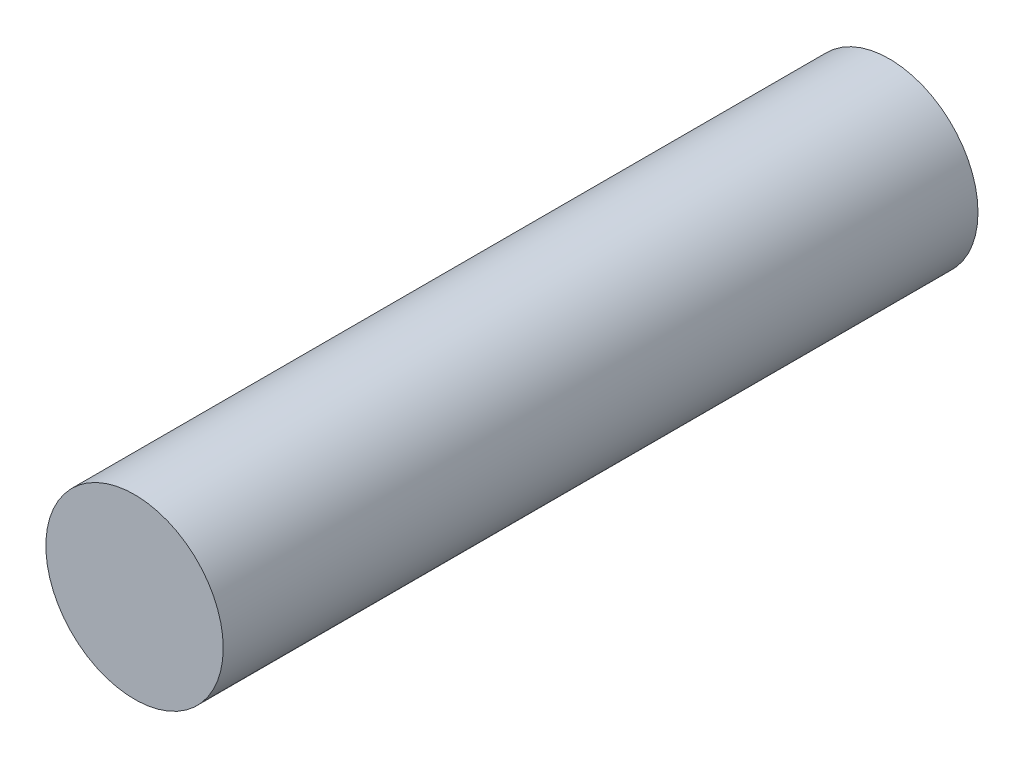
ISO-10303-21;
HEADER;
FILE_DESCRIPTION(('STEP AP214'),'2;1');
FILE_NAME('part.step','',(''),(''),'','','');
FILE_SCHEMA(('AUTOMOTIVE_DESIGN { 1 0 10303 214 1 1 1 1 }'));
ENDSEC;
DATA;
#1=APPLICATION_CONTEXT('core data for automotive mechanical design processes');
#2=APPLICATION_PROTOCOL_DEFINITION('international standard','automotive_design',2000,#1);
#3=PRODUCT_CONTEXT('',#1,'mechanical');
#4=PRODUCT('Part','Part','',(#3));
#5=PRODUCT_RELATED_PRODUCT_CATEGORY('part','',(#4));
#6=PRODUCT_DEFINITION_FORMATION('','',#4);
#7=PRODUCT_DEFINITION_CONTEXT('part definition',#1,'design');
#8=PRODUCT_DEFINITION('design','',#6,#7);
#9=PRODUCT_DEFINITION_SHAPE('','',#8);
#10=(LENGTH_UNIT() NAMED_UNIT(*) SI_UNIT(.MILLI.,.METRE.));
#11=(NAMED_UNIT(*) PLANE_ANGLE_UNIT() SI_UNIT($,.RADIAN.));
#12=(NAMED_UNIT(*) SI_UNIT($,.STERADIAN.) SOLID_ANGLE_UNIT());
#13=UNCERTAINTY_MEASURE_WITH_UNIT(LENGTH_MEASURE(1.E-05),#10,'distance_accuracy_value','');
#14=(GEOMETRIC_REPRESENTATION_CONTEXT(3) GLOBAL_UNCERTAINTY_ASSIGNED_CONTEXT((#13)) GLOBAL_UNIT_ASSIGNED_CONTEXT((#10,
#11,#12)) REPRESENTATION_CONTEXT('',''));
#15=CARTESIAN_POINT('',(0.,0.,0.));
#16=DIRECTION('',(0.,0.,1.));
#17=DIRECTION('',(1.,0.,0.));
#18=AXIS2_PLACEMENT_3D('',#15,#16,#17);
#19=CARTESIAN_POINT('',(0.,0.,20.));
#20=DIRECTION('',(0.,0.,-1.));
#21=DIRECTION('',(-1.,0.,0.));
#22=AXIS2_PLACEMENT_3D('',#19,#20,#21);
#23=CYLINDRICAL_SURFACE('',#22,2.34999999999985);
#24=CARTESIAN_POINT('',(0.,0.,20.));
#25=DIRECTION('',(0.,0.,1.));
#26=DIRECTION('',(1.,0.,0.));
#27=AXIS2_PLACEMENT_3D('',#24,#25,#26);
#28=CIRCLE('',#27,2.34999999999985);
#29=CARTESIAN_POINT('',(2.34999999999985,0.,20.));
#30=VERTEX_POINT('',#29);
#31=EDGE_CURVE('E10',#30,#30,#28,.T.);
#32=ORIENTED_EDGE('',*,*,#31,.F.);
#33=EDGE_LOOP('',(#32));
#34=FACE_BOUND('',#33,.T.);
#35=CARTESIAN_POINT('',(0.,0.,0.));
#36=DIRECTION('',(0.,0.,1.));
#37=DIRECTION('',(1.,0.,0.));
#38=AXIS2_PLACEMENT_3D('',#35,#36,#37);
#39=CIRCLE('',#38,2.34999999999985);
#40=CARTESIAN_POINT('',(2.34999999999985,0.,0.));
#41=VERTEX_POINT('',#40);
#42=EDGE_CURVE('E34',#41,#41,#39,.T.);
#43=ORIENTED_EDGE('',*,*,#42,.T.);
#44=EDGE_LOOP('',(#43));
#45=FACE_BOUND('',#44,.T.);
#46=ADVANCED_FACE('F31',(#34,#45),#23,.T.);
#47=CARTESIAN_POINT('',(0.,0.,20.));
#48=DIRECTION('',(0.,0.,1.));
#49=DIRECTION('',(1.,0.,0.));
#50=AXIS2_PLACEMENT_3D('',#47,#48,#49);
#51=PLANE('',#50);
#52=ORIENTED_EDGE('',*,*,#31,.T.);
#53=EDGE_LOOP('',(#52));
#54=FACE_BOUND('',#53,.T.);
#55=ADVANCED_FACE('F46',(#54),#51,.T.);
#56=CARTESIAN_POINT('',(0.,0.,0.));
#57=DIRECTION('',(0.,0.,1.));
#58=DIRECTION('',(1.,0.,0.));
#59=AXIS2_PLACEMENT_3D('',#56,#57,#58);
#60=PLANE('',#59);
#61=ORIENTED_EDGE('',*,*,#42,.F.);
#62=EDGE_LOOP('',(#61));
#63=FACE_BOUND('',#62,.T.);
#64=ADVANCED_FACE('F44',(#63),#60,.F.);
#65=CLOSED_SHELL('',(#46,#55,#64));
#66=MANIFOLD_SOLID_BREP('B2',#65);
#67=ADVANCED_BREP_SHAPE_REPRESENTATION('',(#18,#66),#14);
#68=SHAPE_DEFINITION_REPRESENTATION(#9,#67);
ENDSEC;
END-ISO-10303-21;
